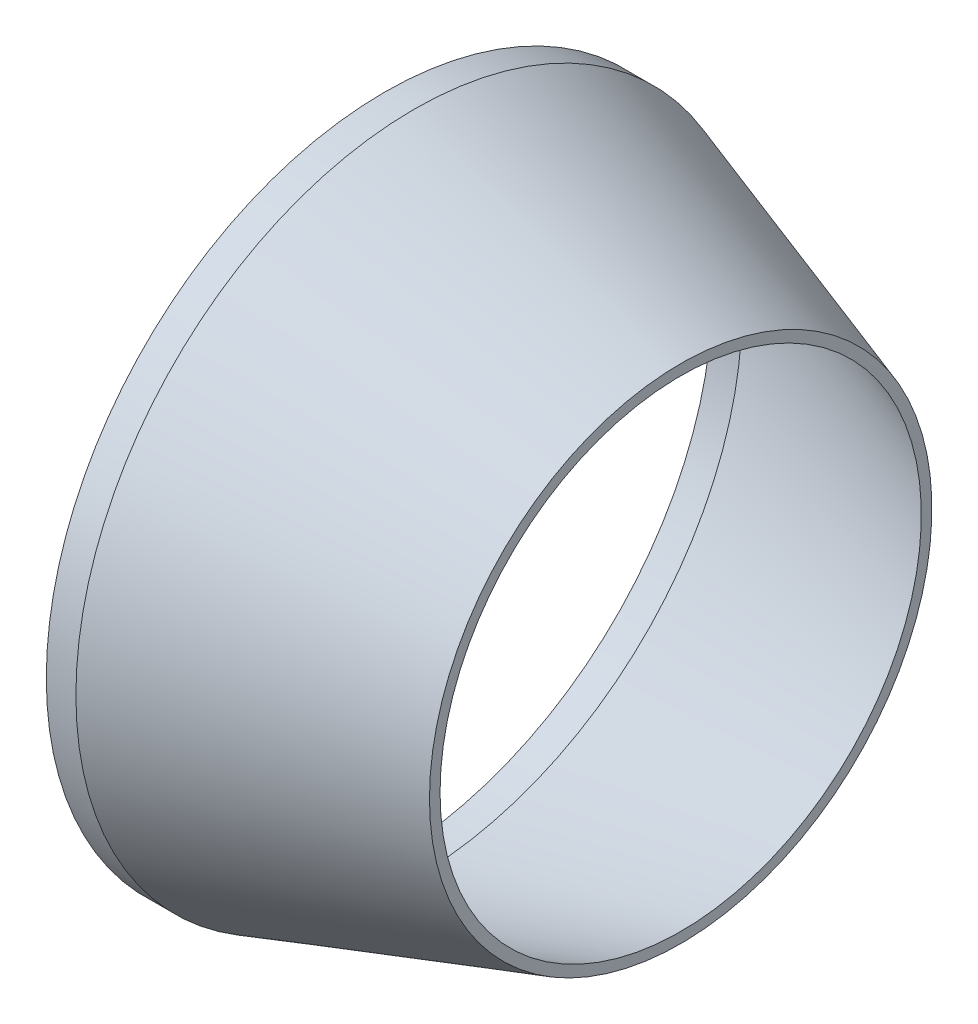
ISO-10303-21;
HEADER;
FILE_DESCRIPTION(('STEP AP214'),'2;1');
FILE_NAME('part.step','',(''),(''),'','','');
FILE_SCHEMA(('AUTOMOTIVE_DESIGN { 1 0 10303 214 1 1 1 1 }'));
ENDSEC;
DATA;
#1=APPLICATION_CONTEXT('core data for automotive mechanical design processes');
#2=APPLICATION_PROTOCOL_DEFINITION('international standard','automotive_design',2000,#1);
#3=PRODUCT_CONTEXT('',#1,'mechanical');
#4=PRODUCT('Part','Part','',(#3));
#5=PRODUCT_RELATED_PRODUCT_CATEGORY('part','',(#4));
#6=PRODUCT_DEFINITION_FORMATION('','',#4);
#7=PRODUCT_DEFINITION_CONTEXT('part definition',#1,'design');
#8=PRODUCT_DEFINITION('design','',#6,#7);
#9=PRODUCT_DEFINITION_SHAPE('','',#8);
#10=(LENGTH_UNIT() NAMED_UNIT(*) SI_UNIT(.MILLI.,.METRE.));
#11=(NAMED_UNIT(*) PLANE_ANGLE_UNIT() SI_UNIT($,.RADIAN.));
#12=(NAMED_UNIT(*) SI_UNIT($,.STERADIAN.) SOLID_ANGLE_UNIT());
#13=UNCERTAINTY_MEASURE_WITH_UNIT(LENGTH_MEASURE(1.E-05),#10,'distance_accuracy_value','');
#14=(GEOMETRIC_REPRESENTATION_CONTEXT(3) GLOBAL_UNCERTAINTY_ASSIGNED_CONTEXT((#13)) GLOBAL_UNIT_ASSIGNED_CONTEXT((#10,
#11,#12)) REPRESENTATION_CONTEXT('',''));
#15=CARTESIAN_POINT('',(0.,0.,0.));
#16=DIRECTION('',(0.,0.,1.));
#17=DIRECTION('',(1.,0.,0.));
#18=AXIS2_PLACEMENT_3D('',#15,#16,#17);
#19=CARTESIAN_POINT('',(44.45,0.,0.));
#20=DIRECTION('',(-1.,0.,0.));
#21=DIRECTION('',(0.,0.,1.));
#22=AXIS2_PLACEMENT_3D('',#19,#20,#21);
#23=PLANE('',#22);
#24=CARTESIAN_POINT('',(44.45,0.,0.));
#25=DIRECTION('',(-1.,0.,0.));
#26=DIRECTION('',(0.,0.,1.));
#27=AXIS2_PLACEMENT_3D('',#24,#25,#26);
#28=CIRCLE('',#27,36.1315);
#29=CARTESIAN_POINT('',(44.45,0.,36.1315));
#30=VERTEX_POINT('',#29);
#31=EDGE_CURVE('E54',#30,#30,#28,.T.);
#32=ORIENTED_EDGE('',*,*,#31,.T.);
#33=EDGE_LOOP('',(#32));
#34=FACE_BOUND('',#33,.T.);
#35=CARTESIAN_POINT('',(44.45,0.,0.));
#36=DIRECTION('',(-1.,0.,0.));
#37=DIRECTION('',(0.,0.,1.));
#38=AXIS2_PLACEMENT_3D('',#35,#36,#37);
#39=CIRCLE('',#38,37.719);
#40=CARTESIAN_POINT('',(44.45,0.,37.719));
#41=VERTEX_POINT('',#40);
#42=EDGE_CURVE('E10',#41,#41,#39,.T.);
#43=ORIENTED_EDGE('',*,*,#42,.F.);
#44=EDGE_LOOP('',(#43));
#45=FACE_BOUND('',#44,.T.);
#46=ADVANCED_FACE('F37',(#34,#45),#23,.F.);
#47=CARTESIAN_POINT('',(44.45,0.,0.));
#48=DIRECTION('',(-1.,0.,0.));
#49=DIRECTION('',(0.,0.,1.));
#50=AXIS2_PLACEMENT_3D('',#47,#48,#49);
#51=CONICAL_SURFACE('',#50,37.719,0.31602542610879);
#52=CARTESIAN_POINT('',(4.445,0.,0.));
#53=DIRECTION('',(-1.,0.,0.));
#54=DIRECTION('',(0.,0.,1.));
#55=AXIS2_PLACEMENT_3D('',#52,#53,#54);
#56=CIRCLE('',#55,50.8);
#57=CARTESIAN_POINT('',(4.445,0.,50.8));
#58=VERTEX_POINT('',#57);
#59=EDGE_CURVE('E44',#58,#58,#56,.T.);
#60=ORIENTED_EDGE('',*,*,#59,.F.);
#61=EDGE_LOOP('',(#60));
#62=FACE_BOUND('',#61,.T.);
#63=ORIENTED_EDGE('',*,*,#42,.T.);
#64=EDGE_LOOP('',(#63));
#65=FACE_BOUND('',#64,.T.);
#66=ADVANCED_FACE('F81',(#62,#65),#51,.T.);
#67=CARTESIAN_POINT('',(0.,0.,0.));
#68=DIRECTION('',(-1.,0.,0.));
#69=DIRECTION('',(0.,0.,1.));
#70=AXIS2_PLACEMENT_3D('',#67,#68,#69);
#71=CYLINDRICAL_SURFACE('',#70,50.8);
#72=CARTESIAN_POINT('',(0.,0.,0.));
#73=DIRECTION('',(-1.,0.,0.));
#74=DIRECTION('',(0.,0.,1.));
#75=AXIS2_PLACEMENT_3D('',#72,#73,#74);
#76=CIRCLE('',#75,50.8);
#77=CARTESIAN_POINT('',(0.,0.,50.8));
#78=VERTEX_POINT('',#77);
#79=EDGE_CURVE('E49',#78,#78,#76,.T.);
#80=ORIENTED_EDGE('',*,*,#79,.F.);
#81=EDGE_LOOP('',(#80));
#82=FACE_BOUND('',#81,.T.);
#83=ORIENTED_EDGE('',*,*,#59,.T.);
#84=EDGE_LOOP('',(#83));
#85=FACE_BOUND('',#84,.T.);
#86=ADVANCED_FACE('F76',(#82,#85),#71,.T.);
#87=CARTESIAN_POINT('',(0.,0.,0.));
#88=DIRECTION('',(1.,0.,0.));
#89=DIRECTION('',(0.,0.,-1.));
#90=AXIS2_PLACEMENT_3D('',#87,#88,#89);
#91=PLANE('',#90);
#92=CARTESIAN_POINT('',(0.,0.,0.));
#93=DIRECTION('',(-1.,0.,0.));
#94=DIRECTION('',(0.,0.,1.));
#95=AXIS2_PLACEMENT_3D('',#92,#93,#94);
#96=CIRCLE('',#95,49.2125);
#97=CARTESIAN_POINT('',(0.,0.,49.2125));
#98=VERTEX_POINT('',#97);
#99=EDGE_CURVE('E64',#98,#98,#96,.T.);
#100=ORIENTED_EDGE('',*,*,#99,.F.);
#101=EDGE_LOOP('',(#100));
#102=FACE_BOUND('',#101,.T.);
#103=ORIENTED_EDGE('',*,*,#79,.T.);
#104=EDGE_LOOP('',(#103));
#105=FACE_BOUND('',#104,.T.);
#106=ADVANCED_FACE('F72',(#102,#105),#91,.F.);
#107=CARTESIAN_POINT('',(44.45,0.,0.));
#108=DIRECTION('',(-1.,0.,0.));
#109=DIRECTION('',(0.,0.,1.));
#110=AXIS2_PLACEMENT_3D('',#107,#108,#109);
#111=CONICAL_SURFACE('',#110,36.1315,0.31602542610879);
#112=CARTESIAN_POINT('',(4.445,0.,0.));
#113=DIRECTION('',(-1.,0.,0.));
#114=DIRECTION('',(0.,0.,1.));
#115=AXIS2_PLACEMENT_3D('',#112,#113,#114);
#116=CIRCLE('',#115,49.2125);
#117=CARTESIAN_POINT('',(4.445,0.,49.2125));
#118=VERTEX_POINT('',#117);
#119=EDGE_CURVE('E60',#118,#118,#116,.T.);
#120=ORIENTED_EDGE('',*,*,#119,.T.);
#121=EDGE_LOOP('',(#120));
#122=FACE_BOUND('',#121,.T.);
#123=ORIENTED_EDGE('',*,*,#31,.F.);
#124=EDGE_LOOP('',(#123));
#125=FACE_BOUND('',#124,.T.);
#126=ADVANCED_FACE('F75',(#122,#125),#111,.F.);
#127=CARTESIAN_POINT('',(0.,0.,0.));
#128=DIRECTION('',(-1.,0.,0.));
#129=DIRECTION('',(0.,0.,1.));
#130=AXIS2_PLACEMENT_3D('',#127,#128,#129);
#131=CYLINDRICAL_SURFACE('',#130,49.2125);
#132=ORIENTED_EDGE('',*,*,#99,.T.);
#133=EDGE_LOOP('',(#132));
#134=FACE_BOUND('',#133,.T.);
#135=ORIENTED_EDGE('',*,*,#119,.F.);
#136=EDGE_LOOP('',(#135));
#137=FACE_BOUND('',#136,.T.);
#138=ADVANCED_FACE('F69',(#134,#137),#131,.F.);
#139=CLOSED_SHELL('',(#46,#66,#86,#106,#126,#138));
#140=MANIFOLD_SOLID_BREP('B2',#139);
#141=ADVANCED_BREP_SHAPE_REPRESENTATION('',(#18,#140),#14);
#142=SHAPE_DEFINITION_REPRESENTATION(#9,#141);
ENDSEC;
END-ISO-10303-21;
